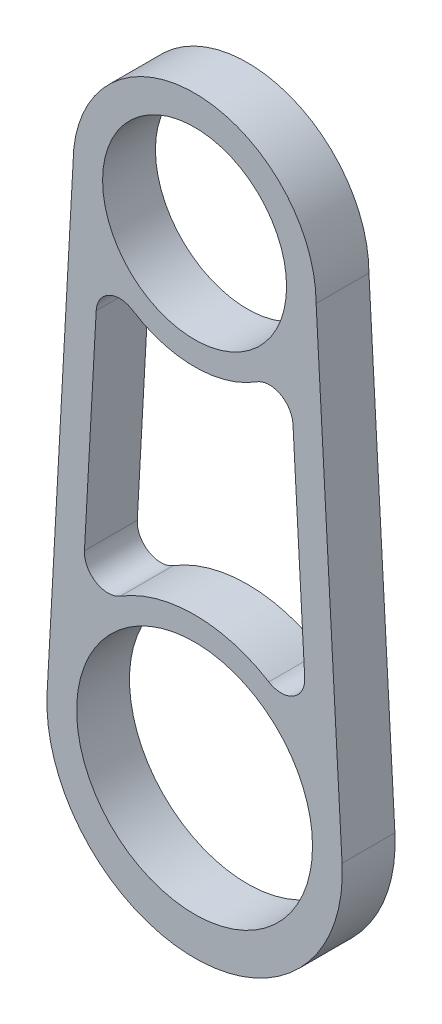
ISO-10303-21;
HEADER;
FILE_DESCRIPTION(('STEP AP214'),'2;1');
FILE_NAME('part.step','',(''),(''),'','','');
FILE_SCHEMA(('AUTOMOTIVE_DESIGN { 1 0 10303 214 1 1 1 1 }'));
ENDSEC;
DATA;
#1=APPLICATION_CONTEXT('core data for automotive mechanical design processes');
#2=APPLICATION_PROTOCOL_DEFINITION('international standard','automotive_design',2000,#1);
#3=PRODUCT_CONTEXT('',#1,'mechanical');
#4=PRODUCT('Part','Part','',(#3));
#5=PRODUCT_RELATED_PRODUCT_CATEGORY('part','',(#4));
#6=PRODUCT_DEFINITION_FORMATION('','',#4);
#7=PRODUCT_DEFINITION_CONTEXT('part definition',#1,'design');
#8=PRODUCT_DEFINITION('design','',#6,#7);
#9=PRODUCT_DEFINITION_SHAPE('','',#8);
#10=(LENGTH_UNIT() NAMED_UNIT(*) SI_UNIT(.MILLI.,.METRE.));
#11=(NAMED_UNIT(*) PLANE_ANGLE_UNIT() SI_UNIT($,.RADIAN.));
#12=(NAMED_UNIT(*) SI_UNIT($,.STERADIAN.) SOLID_ANGLE_UNIT());
#13=UNCERTAINTY_MEASURE_WITH_UNIT(LENGTH_MEASURE(1.E-05),#10,'distance_accuracy_value','');
#14=(GEOMETRIC_REPRESENTATION_CONTEXT(3) GLOBAL_UNCERTAINTY_ASSIGNED_CONTEXT((#13)) GLOBAL_UNIT_ASSIGNED_CONTEXT((#10,
#11,#12)) REPRESENTATION_CONTEXT('',''));
#15=CARTESIAN_POINT('',(0.,0.,0.));
#16=DIRECTION('',(0.,0.,1.));
#17=DIRECTION('',(1.,0.,0.));
#18=AXIS2_PLACEMENT_3D('',#15,#16,#17);
#19=CARTESIAN_POINT('',(0.,50.8,5.6896));
#20=DIRECTION('',(0.,0.,-1.));
#21=DIRECTION('',(-1.,0.,0.));
#22=AXIS2_PLACEMENT_3D('',#19,#20,#21);
#23=CYLINDRICAL_SURFACE('',#22,13.0857985613282);
#24=CARTESIAN_POINT('',(0.,50.8,0.));
#25=DIRECTION('',(0.,0.,1.));
#26=DIRECTION('',(1.,0.,0.));
#27=AXIS2_PLACEMENT_3D('',#24,#25,#26);
#28=CIRCLE('',#27,13.0857985613282);
#29=CARTESIAN_POINT('',(-13.0857985613282,50.8,0.));
#30=VERTEX_POINT('',#29);
#31=CARTESIAN_POINT('',(13.0857985613282,50.8,0.));
#32=VERTEX_POINT('',#31);
#33=EDGE_CURVE('E146',#30,#32,#28,.F.);
#34=ORIENTED_EDGE('',*,*,#33,.F.);
#35=DIRECTION('',(0.,0.,-1.));
#36=VECTOR('',#35,1.);
#37=CARTESIAN_POINT('',(-13.0857985613282,50.8,5.6896));
#38=LINE('',#37,#36);
#39=CARTESIAN_POINT('',(-13.0857985613282,50.8,5.6896));
#40=VERTEX_POINT('',#39);
#41=EDGE_CURVE('E140',#40,#30,#38,.T.);
#42=ORIENTED_EDGE('',*,*,#41,.F.);
#43=CARTESIAN_POINT('',(0.,50.8,5.6896));
#44=DIRECTION('',(0.,0.,1.));
#45=DIRECTION('',(1.,0.,0.));
#46=AXIS2_PLACEMENT_3D('',#43,#44,#45);
#47=CIRCLE('',#46,13.0857985613282);
#48=CARTESIAN_POINT('',(13.0857985613282,50.8,5.6896));
#49=VERTEX_POINT('',#48);
#50=EDGE_CURVE('E143',#40,#49,#47,.F.);
#51=ORIENTED_EDGE('',*,*,#50,.T.);
#52=DIRECTION('',(0.,0.,-1.));
#53=VECTOR('',#52,1.);
#54=CARTESIAN_POINT('',(13.0857985613282,50.8,5.6896));
#55=LINE('',#54,#53);
#56=EDGE_CURVE('E179',#49,#32,#55,.T.);
#57=ORIENTED_EDGE('',*,*,#56,.T.);
#58=EDGE_LOOP('',(#34,#42,#51,#57));
#59=FACE_BOUND('',#58,.T.);
#60=ADVANCED_FACE('F49',(#59),#23,.T.);
#61=CARTESIAN_POINT('',(-15.8319070425246,0.870754887338852,5.6896));
#62=DIRECTION('',(0.998490922857009,-0.0549170007571355,0.));
#63=DIRECTION('',(0.0549170007571355,0.998490922857009,0.));
#64=AXIS2_PLACEMENT_3D('',#61,#62,#63);
#65=PLANE('',#64);
#66=DIRECTION('',(-0.0549170007571355,-0.998490922857009,0.));
#67=VECTOR('',#66,1.);
#68=CARTESIAN_POINT('',(-15.8319070425246,0.870754887338852,0.));
#69=LINE('',#68,#67);
#70=CARTESIAN_POINT('',(-15.8797985613282,0.,0.));
#71=VERTEX_POINT('',#70);
#72=EDGE_CURVE('E205',#30,#71,#69,.T.);
#73=ORIENTED_EDGE('',*,*,#72,.T.);
#74=DIRECTION('',(0.,0.,-1.));
#75=VECTOR('',#74,1.);
#76=CARTESIAN_POINT('',(-15.8797985613282,0.,5.6896));
#77=LINE('',#76,#75);
#78=CARTESIAN_POINT('',(-15.8797985613282,0.,5.6896));
#79=VERTEX_POINT('',#78);
#80=EDGE_CURVE('E152',#79,#71,#77,.T.);
#81=ORIENTED_EDGE('',*,*,#80,.F.);
#82=DIRECTION('',(-0.0549170007571355,-0.998490922857009,0.));
#83=VECTOR('',#82,1.);
#84=CARTESIAN_POINT('',(-15.8319070425246,0.870754887338852,5.6896));
#85=LINE('',#84,#83);
#86=EDGE_CURVE('E156',#40,#79,#85,.T.);
#87=ORIENTED_EDGE('',*,*,#86,.F.);
#88=ORIENTED_EDGE('',*,*,#41,.T.);
#89=EDGE_LOOP('',(#73,#81,#87,#88));
#90=FACE_BOUND('',#89,.T.);
#91=ADVANCED_FACE('F157',(#90),#65,.F.);
#92=CARTESIAN_POINT('',(0.,-0.873388920873052,5.6896));
#93=DIRECTION('',(0.,0.,-1.));
#94=DIRECTION('',(-1.,0.,0.));
#95=AXIS2_PLACEMENT_3D('',#92,#93,#94);
#96=CYLINDRICAL_SURFACE('',#95,15.9037986203129);
#97=CARTESIAN_POINT('',(0.,-0.873388920873052,0.));
#98=DIRECTION('',(0.,0.,1.));
#99=DIRECTION('',(1.,0.,0.));
#100=AXIS2_PLACEMENT_3D('',#97,#98,#99);
#101=CIRCLE('',#100,15.9037986203129);
#102=CARTESIAN_POINT('',(15.8797985613282,0.,0.));
#103=VERTEX_POINT('',#102);
#104=EDGE_CURVE('E208',#71,#103,#101,.T.);
#105=ORIENTED_EDGE('',*,*,#104,.T.);
#106=DIRECTION('',(0.,0.,-1.));
#107=VECTOR('',#106,1.);
#108=CARTESIAN_POINT('',(15.8797985613282,0.,5.6896));
#109=LINE('',#108,#107);
#110=CARTESIAN_POINT('',(15.8797985613282,0.,5.6896));
#111=VERTEX_POINT('',#110);
#112=EDGE_CURVE('E219',#111,#103,#109,.T.);
#113=ORIENTED_EDGE('',*,*,#112,.F.);
#114=CARTESIAN_POINT('',(0.,-0.873388920873052,5.6896));
#115=DIRECTION('',(0.,0.,1.));
#116=DIRECTION('',(1.,0.,0.));
#117=AXIS2_PLACEMENT_3D('',#114,#115,#116);
#118=CIRCLE('',#117,15.9037986203129);
#119=EDGE_CURVE('E161',#79,#111,#118,.T.);
#120=ORIENTED_EDGE('',*,*,#119,.F.);
#121=ORIENTED_EDGE('',*,*,#80,.T.);
#122=EDGE_LOOP('',(#105,#113,#120,#121));
#123=FACE_BOUND('',#122,.T.);
#124=ADVANCED_FACE('F327',(#123),#96,.T.);
#125=CARTESIAN_POINT('',(0.,50.8,5.6896));
#126=DIRECTION('',(0.,0.,-1.));
#127=DIRECTION('',(-1.,0.,0.));
#128=AXIS2_PLACEMENT_3D('',#125,#126,#127);
#129=CYLINDRICAL_SURFACE('',#128,12.446);
#130=CARTESIAN_POINT('',(0.,50.8,0.));
#131=DIRECTION('',(0.,0.,1.));
#132=DIRECTION('',(1.,0.,0.));
#133=AXIS2_PLACEMENT_3D('',#130,#131,#132);
#134=CIRCLE('',#133,12.446);
#135=CARTESIAN_POINT('',(-6.6915138375007,40.3058798099823,0.));
#136=VERTEX_POINT('',#135);
#137=CARTESIAN_POINT('',(6.6915138375007,40.3058798099823,0.));
#138=VERTEX_POINT('',#137);
#139=EDGE_CURVE('E180',#136,#138,#134,.T.);
#140=ORIENTED_EDGE('',*,*,#139,.T.);
#141=DIRECTION('',(0.,0.,-1.));
#142=VECTOR('',#141,1.);
#143=CARTESIAN_POINT('',(6.6915138375007,40.3058798099823,5.6896));
#144=LINE('',#143,#142);
#145=CARTESIAN_POINT('',(6.6915138375007,40.3058798099823,5.6896));
#146=VERTEX_POINT('',#145);
#147=EDGE_CURVE('E234',#138,#146,#144,.F.);
#148=ORIENTED_EDGE('',*,*,#147,.T.);
#149=CARTESIAN_POINT('',(0.,50.8,5.6896));
#150=DIRECTION('',(0.,0.,1.));
#151=DIRECTION('',(1.,0.,0.));
#152=AXIS2_PLACEMENT_3D('',#149,#150,#151);
#153=CIRCLE('',#152,12.446);
#154=CARTESIAN_POINT('',(-6.6915138375007,40.3058798099823,5.6896));
#155=VERTEX_POINT('',#154);
#156=EDGE_CURVE('E216',#155,#146,#153,.T.);
#157=ORIENTED_EDGE('',*,*,#156,.F.);
#158=DIRECTION('',(0.,0.,-1.));
#159=VECTOR('',#158,1.);
#160=CARTESIAN_POINT('',(-6.6915138375007,40.3058798099823,5.6896));
#161=LINE('',#160,#159);
#162=EDGE_CURVE('E230',#155,#136,#161,.T.);
#163=ORIENTED_EDGE('',*,*,#162,.T.);
#164=EDGE_LOOP('',(#140,#148,#157,#163));
#165=FACE_BOUND('',#164,.T.);
#166=ADVANCED_FACE('F346',(#165),#129,.T.);
#167=CARTESIAN_POINT('',(12.6616983624536,0.696393409934947,5.6896));
#168=DIRECTION('',(0.998490922857009,0.0549170007571355,0.));
#169=DIRECTION('',(-0.0549170007571355,0.998490922857009,0.));
#170=AXIS2_PLACEMENT_3D('',#167,#168,#169);
#171=PLANE('',#170);
#172=DIRECTION('',(0.0549170007571355,-0.998490922857009,0.));
#173=VECTOR('',#172,1.);
#174=CARTESIAN_POINT('',(12.6616983624536,0.696393409934947,5.6896));
#175=LINE('',#174,#173);
#176=CARTESIAN_POINT('',(10.5932958504352,38.3037118102692,5.6896));
#177=VERTEX_POINT('',#176);
#178=CARTESIAN_POINT('',(11.8596621770928,15.2788695074039,5.6896));
#179=VERTEX_POINT('',#178);
#180=EDGE_CURVE('E292',#177,#179,#175,.T.);
#181=ORIENTED_EDGE('',*,*,#180,.F.);
#182=DIRECTION('',(0.,0.,1.));
#183=VECTOR('',#182,1.);
#184=CARTESIAN_POINT('',(10.5932958504352,38.3037118102692,0.));
#185=LINE('',#184,#183);
#186=CARTESIAN_POINT('',(10.5932958504352,38.3037118102692,0.));
#187=VERTEX_POINT('',#186);
#188=EDGE_CURVE('E226',#177,#187,#185,.F.);
#189=ORIENTED_EDGE('',*,*,#188,.T.);
#190=DIRECTION('',(0.0549170007571355,-0.998490922857009,0.));
#191=VECTOR('',#190,1.);
#192=CARTESIAN_POINT('',(12.6616983624536,0.696393409934947,0.));
#193=LINE('',#192,#191);
#194=CARTESIAN_POINT('',(11.8596621770928,15.2788695074039,0.));
#195=VERTEX_POINT('',#194);
#196=EDGE_CURVE('E184',#187,#195,#193,.T.);
#197=ORIENTED_EDGE('',*,*,#196,.T.);
#198=DIRECTION('',(0.,0.,1.));
#199=VECTOR('',#198,1.);
#200=CARTESIAN_POINT('',(11.8596621770928,15.2788695074039,5.6896));
#201=LINE('',#200,#199);
#202=EDGE_CURVE('E151',#195,#179,#201,.T.);
#203=ORIENTED_EDGE('',*,*,#202,.T.);
#204=EDGE_LOOP('',(#181,#189,#197,#203));
#205=FACE_BOUND('',#204,.T.);
#206=ADVANCED_FACE('F310',(#205),#171,.F.);
#207=CARTESIAN_POINT('',(0.,0.,5.6896));
#208=DIRECTION('',(0.,0.,-1.));
#209=DIRECTION('',(-1.,0.,0.));
#210=AXIS2_PLACEMENT_3D('',#207,#208,#209);
#211=CYLINDRICAL_SURFACE('',#210,15.24);
#212=CARTESIAN_POINT('',(0.,0.,5.6896));
#213=DIRECTION('',(0.,0.,1.));
#214=DIRECTION('',(1.,0.,0.));
#215=AXIS2_PLACEMENT_3D('',#212,#213,#214);
#216=CIRCLE('',#215,15.24);
#217=CARTESIAN_POINT('',(7.99156734260227,12.976611707555,5.6896));
#218=VERTEX_POINT('',#217);
#219=CARTESIAN_POINT('',(-7.99156734260227,12.976611707555,5.6896));
#220=VERTEX_POINT('',#219);
#221=EDGE_CURVE('E283',#218,#220,#216,.T.);
#222=ORIENTED_EDGE('',*,*,#221,.F.);
#223=DIRECTION('',(0.,0.,-1.));
#224=VECTOR('',#223,1.);
#225=CARTESIAN_POINT('',(7.99156734260227,12.976611707555,5.6896));
#226=LINE('',#225,#224);
#227=CARTESIAN_POINT('',(7.99156734260227,12.976611707555,0.));
#228=VERTEX_POINT('',#227);
#229=EDGE_CURVE('E246',#218,#228,#226,.T.);
#230=ORIENTED_EDGE('',*,*,#229,.T.);
#231=CARTESIAN_POINT('',(0.,0.,0.));
#232=DIRECTION('',(0.,0.,1.));
#233=DIRECTION('',(1.,0.,0.));
#234=AXIS2_PLACEMENT_3D('',#231,#232,#233);
#235=CIRCLE('',#234,15.24);
#236=CARTESIAN_POINT('',(-7.99156734260227,12.976611707555,0.));
#237=VERTEX_POINT('',#236);
#238=EDGE_CURVE('E188',#228,#237,#235,.T.);
#239=ORIENTED_EDGE('',*,*,#238,.T.);
#240=DIRECTION('',(0.,0.,-1.));
#241=VECTOR('',#240,1.);
#242=CARTESIAN_POINT('',(-7.99156734260227,12.976611707555,5.6896));
#243=LINE('',#242,#241);
#244=EDGE_CURVE('E65',#237,#220,#243,.F.);
#245=ORIENTED_EDGE('',*,*,#244,.T.);
#246=EDGE_LOOP('',(#222,#230,#239,#245));
#247=FACE_BOUND('',#246,.T.);
#248=ADVANCED_FACE('F275',(#247),#211,.T.);
#249=CARTESIAN_POINT('',(0.,50.8,5.6896));
#250=DIRECTION('',(0.,0.,-1.));
#251=DIRECTION('',(-1.,0.,0.));
#252=AXIS2_PLACEMENT_3D('',#249,#250,#251);
#253=CYLINDRICAL_SURFACE('',#252,9.906);
#254=CARTESIAN_POINT('',(0.,50.8,5.6896));
#255=DIRECTION('',(0.,0.,1.));
#256=DIRECTION('',(1.,0.,0.));
#257=AXIS2_PLACEMENT_3D('',#254,#255,#256);
#258=CIRCLE('',#257,9.906);
#259=CARTESIAN_POINT('',(9.906,50.8,5.6896));
#260=VERTEX_POINT('',#259);
#261=EDGE_CURVE('E167',#260,#260,#258,.T.);
#262=ORIENTED_EDGE('',*,*,#261,.T.);
#263=EDGE_LOOP('',(#262));
#264=FACE_BOUND('',#263,.T.);
#265=CARTESIAN_POINT('',(0.,50.8,0.));
#266=DIRECTION('',(0.,0.,1.));
#267=DIRECTION('',(1.,0.,0.));
#268=AXIS2_PLACEMENT_3D('',#265,#266,#267);
#269=CIRCLE('',#268,9.906);
#270=CARTESIAN_POINT('',(9.906,50.8,0.));
#271=VERTEX_POINT('',#270);
#272=EDGE_CURVE('E199',#271,#271,#269,.T.);
#273=ORIENTED_EDGE('',*,*,#272,.F.);
#274=EDGE_LOOP('',(#273));
#275=FACE_BOUND('',#274,.T.);
#276=ADVANCED_FACE('F331',(#264,#275),#253,.F.);
#277=CARTESIAN_POINT('',(0.,0.,5.6896));
#278=DIRECTION('',(0.,0.,-1.));
#279=DIRECTION('',(-1.,0.,0.));
#280=AXIS2_PLACEMENT_3D('',#277,#278,#279);
#281=CYLINDRICAL_SURFACE('',#280,12.7);
#282=CARTESIAN_POINT('',(0.,0.,5.6896));
#283=DIRECTION('',(0.,0.,1.));
#284=DIRECTION('',(1.,0.,0.));
#285=AXIS2_PLACEMENT_3D('',#282,#283,#284);
#286=CIRCLE('',#285,12.7);
#287=CARTESIAN_POINT('',(12.7,0.,5.6896));
#288=VERTEX_POINT('',#287);
#289=EDGE_CURVE('E171',#288,#288,#286,.T.);
#290=ORIENTED_EDGE('',*,*,#289,.T.);
#291=EDGE_LOOP('',(#290));
#292=FACE_BOUND('',#291,.T.);
#293=CARTESIAN_POINT('',(0.,0.,0.));
#294=DIRECTION('',(0.,0.,1.));
#295=DIRECTION('',(1.,0.,0.));
#296=AXIS2_PLACEMENT_3D('',#293,#294,#295);
#297=CIRCLE('',#296,12.7);
#298=CARTESIAN_POINT('',(12.7,0.,0.));
#299=VERTEX_POINT('',#298);
#300=EDGE_CURVE('E195',#299,#299,#297,.T.);
#301=ORIENTED_EDGE('',*,*,#300,.F.);
#302=EDGE_LOOP('',(#301));
#303=FACE_BOUND('',#302,.T.);
#304=ADVANCED_FACE('F334',(#292,#303),#281,.F.);
#305=CARTESIAN_POINT('',(-12.6616983624536,0.696393409934947,5.6896));
#306=DIRECTION('',(0.998490922857009,-0.0549170007571355,0.));
#307=DIRECTION('',(0.0549170007571355,0.998490922857009,0.));
#308=AXIS2_PLACEMENT_3D('',#305,#306,#307);
#309=PLANE('',#308);
#310=DIRECTION('',(-0.0549170007571355,-0.998490922857009,0.));
#311=VECTOR('',#310,1.);
#312=CARTESIAN_POINT('',(-12.6616983624536,0.696393409934947,0.));
#313=LINE('',#312,#311);
#314=CARTESIAN_POINT('',(-10.5932958504352,38.3037118102692,0.));
#315=VERTEX_POINT('',#314);
#316=CARTESIAN_POINT('',(-11.8596621770928,15.2788695074039,0.));
#317=VERTEX_POINT('',#316);
#318=EDGE_CURVE('E191',#315,#317,#313,.T.);
#319=ORIENTED_EDGE('',*,*,#318,.F.);
#320=DIRECTION('',(0.,0.,-1.));
#321=VECTOR('',#320,1.);
#322=CARTESIAN_POINT('',(-10.5932958504352,38.3037118102692,5.6896));
#323=LINE('',#322,#321);
#324=CARTESIAN_POINT('',(-10.5932958504352,38.3037118102692,5.6896));
#325=VERTEX_POINT('',#324);
#326=EDGE_CURVE('E241',#315,#325,#323,.F.);
#327=ORIENTED_EDGE('',*,*,#326,.T.);
#328=DIRECTION('',(-0.0549170007571355,-0.998490922857009,0.));
#329=VECTOR('',#328,1.);
#330=CARTESIAN_POINT('',(-12.6616983624536,0.696393409934947,5.6896));
#331=LINE('',#330,#329);
#332=CARTESIAN_POINT('',(-11.8596621770928,15.2788695074039,5.6896));
#333=VERTEX_POINT('',#332);
#334=EDGE_CURVE('E281',#325,#333,#331,.T.);
#335=ORIENTED_EDGE('',*,*,#334,.T.);
#336=DIRECTION('',(0.,0.,-1.));
#337=VECTOR('',#336,1.);
#338=CARTESIAN_POINT('',(-11.8596621770928,15.2788695074039,5.6896));
#339=LINE('',#338,#337);
#340=EDGE_CURVE('E237',#333,#317,#339,.T.);
#341=ORIENTED_EDGE('',*,*,#340,.T.);
#342=EDGE_LOOP('',(#319,#327,#335,#341));
#343=FACE_BOUND('',#342,.T.);
#344=ADVANCED_FACE('F285',(#343),#309,.T.);
#345=CARTESIAN_POINT('',(15.8319070425246,0.87075488733885,5.6896));
#346=DIRECTION('',(0.998490922857009,0.0549170007571353,0.));
#347=DIRECTION('',(-0.0549170007571353,0.998490922857009,0.));
#348=AXIS2_PLACEMENT_3D('',#345,#346,#347);
#349=PLANE('',#348);
#350=DIRECTION('',(0.0549170007571353,-0.998490922857009,0.));
#351=VECTOR('',#350,1.);
#352=CARTESIAN_POINT('',(15.8319070425246,0.87075488733885,0.));
#353=LINE('',#352,#351);
#354=EDGE_CURVE('E212',#32,#103,#353,.T.);
#355=ORIENTED_EDGE('',*,*,#354,.F.);
#356=ORIENTED_EDGE('',*,*,#56,.F.);
#357=DIRECTION('',(0.0549170007571353,-0.998490922857009,0.));
#358=VECTOR('',#357,1.);
#359=CARTESIAN_POINT('',(15.8319070425246,0.87075488733885,5.6896));
#360=LINE('',#359,#358);
#361=EDGE_CURVE('E165',#49,#111,#360,.T.);
#362=ORIENTED_EDGE('',*,*,#361,.T.);
#363=ORIENTED_EDGE('',*,*,#112,.T.);
#364=EDGE_LOOP('',(#355,#356,#362,#363));
#365=FACE_BOUND('',#364,.T.);
#366=ADVANCED_FACE('F341',(#365),#349,.T.);
#367=CARTESIAN_POINT('',(0.,0.,5.6896));
#368=DIRECTION('',(0.,0.,1.));
#369=DIRECTION('',(1.,0.,0.));
#370=AXIS2_PLACEMENT_3D('',#367,#368,#369);
#371=PLANE('',#370);
#372=ORIENTED_EDGE('',*,*,#334,.F.);
#373=CARTESIAN_POINT('',(-8.05712890637839,38.1642226283461,5.6896));
#374=DIRECTION('',(0.,0.,1.));
#375=DIRECTION('',(1.,0.,0.));
#376=AXIS2_PLACEMENT_3D('',#373,#374,#375);
#377=CIRCLE('',#376,2.54);
#378=EDGE_CURVE('E259',#325,#155,#377,.F.);
#379=ORIENTED_EDGE('',*,*,#378,.T.);
#380=ORIENTED_EDGE('',*,*,#156,.T.);
#381=CARTESIAN_POINT('',(8.05712890637839,38.1642226283461,5.6896));
#382=DIRECTION('',(0.,0.,1.));
#383=DIRECTION('',(1.,0.,0.));
#384=AXIS2_PLACEMENT_3D('',#381,#382,#383);
#385=CIRCLE('',#384,2.54);
#386=EDGE_CURVE('E253',#146,#177,#385,.F.);
#387=ORIENTED_EDGE('',*,*,#386,.T.);
#388=ORIENTED_EDGE('',*,*,#180,.T.);
#389=CARTESIAN_POINT('',(9.32349523303598,15.1393803254808,5.6896));
#390=DIRECTION('',(0.,0.,1.));
#391=DIRECTION('',(1.,0.,0.));
#392=AXIS2_PLACEMENT_3D('',#389,#390,#391);
#393=CIRCLE('',#392,2.54);
#394=EDGE_CURVE('E72',#179,#218,#393,.F.);
#395=ORIENTED_EDGE('',*,*,#394,.T.);
#396=ORIENTED_EDGE('',*,*,#221,.T.);
#397=CARTESIAN_POINT('',(-9.32349523303598,15.1393803254808,5.6896));
#398=DIRECTION('',(0.,0.,1.));
#399=DIRECTION('',(1.,0.,0.));
#400=AXIS2_PLACEMENT_3D('',#397,#398,#399);
#401=CIRCLE('',#400,2.54);
#402=EDGE_CURVE('E11',#220,#333,#401,.F.);
#403=ORIENTED_EDGE('',*,*,#402,.T.);
#404=EDGE_LOOP('',(#372,#379,#380,#387,#388,#395,#396,#403));
#405=FACE_BOUND('',#404,.T.);
#406=ORIENTED_EDGE('',*,*,#289,.F.);
#407=EDGE_LOOP('',(#406));
#408=FACE_BOUND('',#407,.T.);
#409=ORIENTED_EDGE('',*,*,#261,.F.);
#410=EDGE_LOOP('',(#409));
#411=FACE_BOUND('',#410,.T.);
#412=ORIENTED_EDGE('',*,*,#50,.F.);
#413=ORIENTED_EDGE('',*,*,#86,.T.);
#414=ORIENTED_EDGE('',*,*,#119,.T.);
#415=ORIENTED_EDGE('',*,*,#361,.F.);
#416=EDGE_LOOP('',(#412,#413,#414,#415));
#417=FACE_BOUND('',#416,.T.);
#418=ADVANCED_FACE('F163',(#405,#408,#411,#417),#371,.T.);
#419=CARTESIAN_POINT('',(0.,0.,0.));
#420=DIRECTION('',(0.,0.,1.));
#421=DIRECTION('',(1.,0.,0.));
#422=AXIS2_PLACEMENT_3D('',#419,#420,#421);
#423=PLANE('',#422);
#424=ORIENTED_EDGE('',*,*,#139,.F.);
#425=CARTESIAN_POINT('',(-8.05712890637839,38.1642226283461,0.));
#426=DIRECTION('',(0.,0.,1.));
#427=DIRECTION('',(1.,0.,0.));
#428=AXIS2_PLACEMENT_3D('',#425,#426,#427);
#429=CIRCLE('',#428,2.54);
#430=EDGE_CURVE('E256',#136,#315,#429,.T.);
#431=ORIENTED_EDGE('',*,*,#430,.T.);
#432=ORIENTED_EDGE('',*,*,#318,.T.);
#433=CARTESIAN_POINT('',(-9.32349523303598,15.1393803254808,0.));
#434=DIRECTION('',(0.,0.,1.));
#435=DIRECTION('',(1.,0.,0.));
#436=AXIS2_PLACEMENT_3D('',#433,#434,#435);
#437=CIRCLE('',#436,2.54);
#438=EDGE_CURVE('E58',#317,#237,#437,.T.);
#439=ORIENTED_EDGE('',*,*,#438,.T.);
#440=ORIENTED_EDGE('',*,*,#238,.F.);
#441=CARTESIAN_POINT('',(9.32349523303598,15.1393803254808,0.));
#442=DIRECTION('',(0.,0.,1.));
#443=DIRECTION('',(1.,0.,0.));
#444=AXIS2_PLACEMENT_3D('',#441,#442,#443);
#445=CIRCLE('',#444,2.54);
#446=EDGE_CURVE('E262',#228,#195,#445,.T.);
#447=ORIENTED_EDGE('',*,*,#446,.T.);
#448=ORIENTED_EDGE('',*,*,#196,.F.);
#449=CARTESIAN_POINT('',(8.05712890637839,38.1642226283461,0.));
#450=DIRECTION('',(0.,0.,1.));
#451=DIRECTION('',(1.,0.,0.));
#452=AXIS2_PLACEMENT_3D('',#449,#450,#451);
#453=CIRCLE('',#452,2.54);
#454=EDGE_CURVE('E250',#187,#138,#453,.T.);
#455=ORIENTED_EDGE('',*,*,#454,.T.);
#456=EDGE_LOOP('',(#424,#431,#432,#439,#440,#447,#448,#455));
#457=FACE_BOUND('',#456,.T.);
#458=ORIENTED_EDGE('',*,*,#300,.T.);
#459=EDGE_LOOP('',(#458));
#460=FACE_BOUND('',#459,.T.);
#461=ORIENTED_EDGE('',*,*,#272,.T.);
#462=EDGE_LOOP('',(#461));
#463=FACE_BOUND('',#462,.T.);
#464=ORIENTED_EDGE('',*,*,#33,.T.);
#465=ORIENTED_EDGE('',*,*,#354,.T.);
#466=ORIENTED_EDGE('',*,*,#104,.F.);
#467=ORIENTED_EDGE('',*,*,#72,.F.);
#468=EDGE_LOOP('',(#464,#465,#466,#467));
#469=FACE_BOUND('',#468,.T.);
#470=ADVANCED_FACE('F270',(#457,#460,#463,#469),#423,.F.);
#471=CARTESIAN_POINT('',(8.05712890637839,38.1642226283461,5.6896));
#472=DIRECTION('',(0.,0.,-1.));
#473=DIRECTION('',(-1.,0.,0.));
#474=AXIS2_PLACEMENT_3D('',#471,#472,#473);
#475=CYLINDRICAL_SURFACE('',#474,2.54);
#476=ORIENTED_EDGE('',*,*,#386,.F.);
#477=ORIENTED_EDGE('',*,*,#147,.F.);
#478=ORIENTED_EDGE('',*,*,#454,.F.);
#479=ORIENTED_EDGE('',*,*,#188,.F.);
#480=EDGE_LOOP('',(#476,#477,#478,#479));
#481=FACE_BOUND('',#480,.T.);
#482=ADVANCED_FACE('F307',(#481),#475,.F.);
#483=CARTESIAN_POINT('',(-8.05712890637839,38.1642226283461,5.6896));
#484=DIRECTION('',(0.,0.,-1.));
#485=DIRECTION('',(-1.,0.,0.));
#486=AXIS2_PLACEMENT_3D('',#483,#484,#485);
#487=CYLINDRICAL_SURFACE('',#486,2.54);
#488=ORIENTED_EDGE('',*,*,#378,.F.);
#489=ORIENTED_EDGE('',*,*,#326,.F.);
#490=ORIENTED_EDGE('',*,*,#430,.F.);
#491=ORIENTED_EDGE('',*,*,#162,.F.);
#492=EDGE_LOOP('',(#488,#489,#490,#491));
#493=FACE_BOUND('',#492,.T.);
#494=ADVANCED_FACE('F315',(#493),#487,.F.);
#495=CARTESIAN_POINT('',(9.32349523303598,15.1393803254808,5.6896));
#496=DIRECTION('',(0.,0.,-1.));
#497=DIRECTION('',(-1.,0.,0.));
#498=AXIS2_PLACEMENT_3D('',#495,#496,#497);
#499=CYLINDRICAL_SURFACE('',#498,2.54);
#500=ORIENTED_EDGE('',*,*,#394,.F.);
#501=ORIENTED_EDGE('',*,*,#202,.F.);
#502=ORIENTED_EDGE('',*,*,#446,.F.);
#503=ORIENTED_EDGE('',*,*,#229,.F.);
#504=EDGE_LOOP('',(#500,#501,#502,#503));
#505=FACE_BOUND('',#504,.T.);
#506=ADVANCED_FACE('F313',(#505),#499,.F.);
#507=CARTESIAN_POINT('',(-9.32349523303598,15.1393803254808,5.6896));
#508=DIRECTION('',(0.,0.,-1.));
#509=DIRECTION('',(-1.,0.,0.));
#510=AXIS2_PLACEMENT_3D('',#507,#508,#509);
#511=CYLINDRICAL_SURFACE('',#510,2.54);
#512=ORIENTED_EDGE('',*,*,#402,.F.);
#513=ORIENTED_EDGE('',*,*,#244,.F.);
#514=ORIENTED_EDGE('',*,*,#438,.F.);
#515=ORIENTED_EDGE('',*,*,#340,.F.);
#516=EDGE_LOOP('',(#512,#513,#514,#515));
#517=FACE_BOUND('',#516,.T.);
#518=ADVANCED_FACE('F51',(#517),#511,.F.);
#519=CLOSED_SHELL('',(#60,#91,#124,#166,#206,#248,#276,#304,#344,#366,#418,#470,#482,#494,#506,#518));
#520=MANIFOLD_SOLID_BREP('B2',#519);
#521=ADVANCED_BREP_SHAPE_REPRESENTATION('',(#18,#520),#14);
#522=SHAPE_DEFINITION_REPRESENTATION(#9,#521);
ENDSEC;
END-ISO-10303-21;
